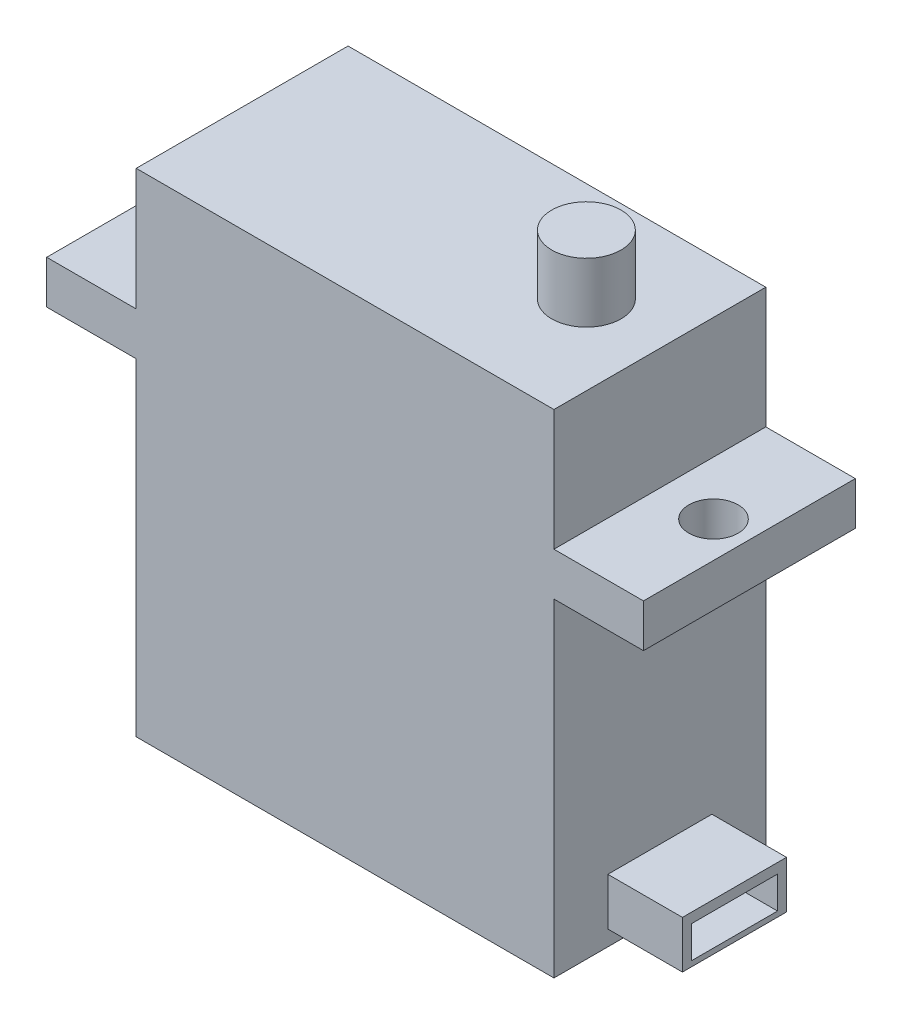
ISO-10303-21;
HEADER;
FILE_DESCRIPTION(('STEP AP214'),'2;1');
FILE_NAME('part.step','',(''),(''),'','','');
FILE_SCHEMA(('AUTOMOTIVE_DESIGN { 1 0 10303 214 1 1 1 1 }'));
ENDSEC;
DATA;
#1=APPLICATION_CONTEXT('core data for automotive mechanical design processes');
#2=APPLICATION_PROTOCOL_DEFINITION('international standard','automotive_design',2000,#1);
#3=PRODUCT_CONTEXT('',#1,'mechanical');
#4=PRODUCT('Part','Part','',(#3));
#5=PRODUCT_RELATED_PRODUCT_CATEGORY('part','',(#4));
#6=PRODUCT_DEFINITION_FORMATION('','',#4);
#7=PRODUCT_DEFINITION_CONTEXT('part definition',#1,'design');
#8=PRODUCT_DEFINITION('design','',#6,#7);
#9=PRODUCT_DEFINITION_SHAPE('','',#8);
#10=(LENGTH_UNIT() NAMED_UNIT(*) SI_UNIT(.MILLI.,.METRE.));
#11=(NAMED_UNIT(*) PLANE_ANGLE_UNIT() SI_UNIT($,.RADIAN.));
#12=(NAMED_UNIT(*) SI_UNIT($,.STERADIAN.) SOLID_ANGLE_UNIT());
#13=UNCERTAINTY_MEASURE_WITH_UNIT(LENGTH_MEASURE(1.E-05),#10,'distance_accuracy_value','');
#14=(GEOMETRIC_REPRESENTATION_CONTEXT(3) GLOBAL_UNCERTAINTY_ASSIGNED_CONTEXT((#13)) GLOBAL_UNIT_ASSIGNED_CONTEXT((#10,
#11,#12)) REPRESENTATION_CONTEXT('',''));
#15=CARTESIAN_POINT('',(0.,0.,0.));
#16=DIRECTION('',(0.,0.,1.));
#17=DIRECTION('',(1.,0.,0.));
#18=AXIS2_PLACEMENT_3D('',#15,#16,#17);
#19=CARTESIAN_POINT('',(0.,33.,0.));
#20=DIRECTION('',(-1.,0.,0.));
#21=DIRECTION('',(0.,0.,1.));
#22=AXIS2_PLACEMENT_3D('',#19,#20,#21);
#23=PLANE('',#22);
#24=DIRECTION('',(0.,-1.,0.));
#25=VECTOR('',#24,1.);
#26=CARTESIAN_POINT('',(0.,1.03633654772768,-3.61262373338085));
#27=LINE('',#26,#25);
#28=CARTESIAN_POINT('',(0.,4.21264494239171,-3.61262373338085));
#29=VERTEX_POINT('',#28);
#30=CARTESIAN_POINT('',(0.,1.03633654772768,-3.61262373338085));
#31=VERTEX_POINT('',#30);
#32=EDGE_CURVE('E270',#29,#31,#27,.T.);
#33=ORIENTED_EDGE('',*,*,#32,.F.);
#34=DIRECTION('',(0.,0.,1.));
#35=VECTOR('',#34,1.);
#36=CARTESIAN_POINT('',(0.,4.21264494239171,-10.5873762666191));
#37=LINE('',#36,#35);
#38=CARTESIAN_POINT('',(0.,4.21264494239171,-10.5873762666191));
#39=VERTEX_POINT('',#38);
#40=EDGE_CURVE('E281',#39,#29,#37,.T.);
#41=ORIENTED_EDGE('',*,*,#40,.F.);
#42=DIRECTION('',(0.,1.,0.));
#43=VECTOR('',#42,1.);
#44=CARTESIAN_POINT('',(0.,1.03633654772768,-10.5873762666191));
#45=LINE('',#44,#43);
#46=CARTESIAN_POINT('',(0.,1.03633654772768,-10.5873762666191));
#47=VERTEX_POINT('',#46);
#48=EDGE_CURVE('E293',#47,#39,#45,.T.);
#49=ORIENTED_EDGE('',*,*,#48,.F.);
#50=DIRECTION('',(0.,0.,-1.));
#51=VECTOR('',#50,1.);
#52=CARTESIAN_POINT('',(0.,1.03633654772768,-10.5873762666191));
#53=LINE('',#52,#51);
#54=EDGE_CURVE('E290',#31,#47,#53,.T.);
#55=ORIENTED_EDGE('',*,*,#54,.F.);
#56=EDGE_LOOP('',(#33,#41,#49,#55));
#57=FACE_BOUND('',#56,.T.);
#58=DIRECTION('',(0.,0.,-1.));
#59=VECTOR('',#58,1.);
#60=CARTESIAN_POINT('',(0.,22.,0.));
#61=LINE('',#60,#59);
#62=CARTESIAN_POINT('',(0.,22.,0.));
#63=VERTEX_POINT('',#62);
#64=CARTESIAN_POINT('',(0.,22.,-14.2));
#65=VERTEX_POINT('',#64);
#66=EDGE_CURVE('E204',#63,#65,#61,.T.);
#67=ORIENTED_EDGE('',*,*,#66,.F.);
#68=DIRECTION('',(0.,-1.,0.));
#69=VECTOR('',#68,1.);
#70=CARTESIAN_POINT('',(0.,33.,0.));
#71=LINE('',#70,#69);
#72=CARTESIAN_POINT('',(0.,0.,0.));
#73=VERTEX_POINT('',#72);
#74=EDGE_CURVE('E326',#63,#73,#71,.T.);
#75=ORIENTED_EDGE('',*,*,#74,.T.);
#76=DIRECTION('',(0.,0.,-1.));
#77=VECTOR('',#76,1.);
#78=CARTESIAN_POINT('',(0.,0.,0.));
#79=LINE('',#78,#77);
#80=CARTESIAN_POINT('',(0.,0.,-14.2));
#81=VERTEX_POINT('',#80);
#82=EDGE_CURVE('E313',#73,#81,#79,.T.);
#83=ORIENTED_EDGE('',*,*,#82,.T.);
#84=DIRECTION('',(0.,-1.,0.));
#85=VECTOR('',#84,1.);
#86=CARTESIAN_POINT('',(0.,33.,-14.2));
#87=LINE('',#86,#85);
#88=EDGE_CURVE('E50',#65,#81,#87,.T.);
#89=ORIENTED_EDGE('',*,*,#88,.F.);
#90=EDGE_LOOP('',(#67,#75,#83,#89));
#91=FACE_BOUND('',#90,.T.);
#92=ADVANCED_FACE('F41',(#57,#91),#23,.F.);
#93=CARTESIAN_POINT('',(-28.,33.,0.));
#94=DIRECTION('',(1.,0.,0.));
#95=DIRECTION('',(0.,0.,-1.));
#96=AXIS2_PLACEMENT_3D('',#93,#94,#95);
#97=PLANE('',#96);
#98=DIRECTION('',(0.,-1.,0.));
#99=VECTOR('',#98,1.);
#100=CARTESIAN_POINT('',(-28.,33.,-14.2));
#101=LINE('',#100,#99);
#102=CARTESIAN_POINT('',(-28.,33.,-14.2));
#103=VERTEX_POINT('',#102);
#104=CARTESIAN_POINT('',(-28.,24.8366827877608,-14.2));
#105=VERTEX_POINT('',#104);
#106=EDGE_CURVE('E342',#103,#105,#101,.T.);
#107=ORIENTED_EDGE('',*,*,#106,.T.);
#108=DIRECTION('',(0.,0.,1.));
#109=VECTOR('',#108,1.);
#110=CARTESIAN_POINT('',(-28.,24.8366827877608,0.));
#111=LINE('',#110,#109);
#112=CARTESIAN_POINT('',(-28.,24.8366827877608,0.));
#113=VERTEX_POINT('',#112);
#114=EDGE_CURVE('E216',#105,#113,#111,.T.);
#115=ORIENTED_EDGE('',*,*,#114,.T.);
#116=DIRECTION('',(0.,-1.,0.));
#117=VECTOR('',#116,1.);
#118=CARTESIAN_POINT('',(-28.,33.,0.));
#119=LINE('',#118,#117);
#120=CARTESIAN_POINT('',(-28.,33.,0.));
#121=VERTEX_POINT('',#120);
#122=EDGE_CURVE('E338',#121,#113,#119,.T.);
#123=ORIENTED_EDGE('',*,*,#122,.F.);
#124=DIRECTION('',(0.,0.,1.));
#125=VECTOR('',#124,1.);
#126=CARTESIAN_POINT('',(-28.,33.,0.));
#127=LINE('',#126,#125);
#128=EDGE_CURVE('E322',#103,#121,#127,.T.);
#129=ORIENTED_EDGE('',*,*,#128,.F.);
#130=EDGE_LOOP('',(#107,#115,#123,#129));
#131=FACE_BOUND('',#130,.T.);
#132=ADVANCED_FACE('F372',(#131),#97,.F.);
#133=CARTESIAN_POINT('',(0.,33.,0.));
#134=VERTEX_POINT('',#133);
#135=CARTESIAN_POINT('',(0.,24.89,0.));
#136=VERTEX_POINT('',#135);
#137=EDGE_CURVE('E335',#134,#136,#71,.T.);
#138=ORIENTED_EDGE('',*,*,#137,.T.);
#139=DIRECTION('',(0.,0.,-1.));
#140=VECTOR('',#139,1.);
#141=CARTESIAN_POINT('',(0.,24.89,0.));
#142=LINE('',#141,#140);
#143=CARTESIAN_POINT('',(0.,24.89,-14.2));
#144=VERTEX_POINT('',#143);
#145=EDGE_CURVE('E65',#136,#144,#142,.T.);
#146=ORIENTED_EDGE('',*,*,#145,.T.);
#147=CARTESIAN_POINT('',(0.,33.,-14.2));
#148=VERTEX_POINT('',#147);
#149=EDGE_CURVE('E11',#148,#144,#87,.T.);
#150=ORIENTED_EDGE('',*,*,#149,.F.);
#151=DIRECTION('',(0.,0.,-1.));
#152=VECTOR('',#151,1.);
#153=CARTESIAN_POINT('',(0.,33.,0.));
#154=LINE('',#153,#152);
#155=EDGE_CURVE('E316',#134,#148,#154,.T.);
#156=ORIENTED_EDGE('',*,*,#155,.F.);
#157=EDGE_LOOP('',(#138,#146,#150,#156));
#158=FACE_BOUND('',#157,.T.);
#159=ADVANCED_FACE('F43',(#158),#23,.F.);
#160=CARTESIAN_POINT('',(0.,33.,-14.2));
#161=DIRECTION('',(0.,0.,1.));
#162=DIRECTION('',(1.,0.,0.));
#163=AXIS2_PLACEMENT_3D('',#160,#161,#162);
#164=PLANE('',#163);
#165=DIRECTION('',(-1.,0.,0.));
#166=VECTOR('',#165,1.);
#167=CARTESIAN_POINT('',(0.,0.,-14.2));
#168=LINE('',#167,#166);
#169=CARTESIAN_POINT('',(-28.,0.,-14.2));
#170=VERTEX_POINT('',#169);
#171=EDGE_CURVE('E328',#81,#170,#168,.T.);
#172=ORIENTED_EDGE('',*,*,#171,.T.);
#173=CARTESIAN_POINT('',(-28.,21.9439231611703,-14.2));
#174=VERTEX_POINT('',#173);
#175=EDGE_CURVE('E341',#174,#170,#101,.T.);
#176=ORIENTED_EDGE('',*,*,#175,.F.);
#177=DIRECTION('',(1.,0.,0.));
#178=VECTOR('',#177,1.);
#179=CARTESIAN_POINT('',(-34.,21.9439231611703,-14.2));
#180=LINE('',#179,#178);
#181=CARTESIAN_POINT('',(-34.,21.9439231611703,-14.2));
#182=VERTEX_POINT('',#181);
#183=EDGE_CURVE('E240',#182,#174,#180,.T.);
#184=ORIENTED_EDGE('',*,*,#183,.F.);
#185=DIRECTION('',(0.,-1.,0.));
#186=VECTOR('',#185,1.);
#187=CARTESIAN_POINT('',(-34.,0.,-14.2));
#188=LINE('',#187,#186);
#189=CARTESIAN_POINT('',(-34.,24.8366827877608,-14.2));
#190=VERTEX_POINT('',#189);
#191=EDGE_CURVE('E224',#190,#182,#188,.T.);
#192=ORIENTED_EDGE('',*,*,#191,.F.);
#193=DIRECTION('',(1.,0.,0.));
#194=VECTOR('',#193,1.);
#195=CARTESIAN_POINT('',(-34.,24.8366827877608,-14.2));
#196=LINE('',#195,#194);
#197=EDGE_CURVE('E242',#190,#105,#196,.T.);
#198=ORIENTED_EDGE('',*,*,#197,.T.);
#199=ORIENTED_EDGE('',*,*,#106,.F.);
#200=DIRECTION('',(-1.,0.,0.));
#201=VECTOR('',#200,1.);
#202=CARTESIAN_POINT('',(0.,33.,-14.2));
#203=LINE('',#202,#201);
#204=EDGE_CURVE('E319',#148,#103,#203,.T.);
#205=ORIENTED_EDGE('',*,*,#204,.F.);
#206=ORIENTED_EDGE('',*,*,#149,.T.);
#207=DIRECTION('',(-1.,0.,0.));
#208=VECTOR('',#207,1.);
#209=CARTESIAN_POINT('',(6.,24.89,-14.2));
#210=LINE('',#209,#208);
#211=CARTESIAN_POINT('',(6.,24.89,-14.2));
#212=VERTEX_POINT('',#211);
#213=EDGE_CURVE('E194',#212,#144,#210,.T.);
#214=ORIENTED_EDGE('',*,*,#213,.F.);
#215=DIRECTION('',(0.,1.,0.));
#216=VECTOR('',#215,1.);
#217=CARTESIAN_POINT('',(6.,22.,-14.2));
#218=LINE('',#217,#216);
#219=CARTESIAN_POINT('',(6.,22.,-14.2));
#220=VERTEX_POINT('',#219);
#221=EDGE_CURVE('E180',#220,#212,#218,.T.);
#222=ORIENTED_EDGE('',*,*,#221,.F.);
#223=DIRECTION('',(-1.,0.,0.));
#224=VECTOR('',#223,1.);
#225=CARTESIAN_POINT('',(6.,22.,-14.2));
#226=LINE('',#225,#224);
#227=EDGE_CURVE('E198',#220,#65,#226,.T.);
#228=ORIENTED_EDGE('',*,*,#227,.T.);
#229=ORIENTED_EDGE('',*,*,#88,.T.);
#230=EDGE_LOOP('',(#172,#176,#184,#192,#198,#199,#205,#206,#214,#222,#228,#229));
#231=FACE_BOUND('',#230,.T.);
#232=ADVANCED_FACE('F196',(#231),#164,.F.);
#233=CARTESIAN_POINT('',(-28.,21.9439231611703,0.));
#234=VERTEX_POINT('',#233);
#235=CARTESIAN_POINT('',(-28.,0.,0.));
#236=VERTEX_POINT('',#235);
#237=EDGE_CURVE('E337',#234,#236,#119,.T.);
#238=ORIENTED_EDGE('',*,*,#237,.F.);
#239=DIRECTION('',(0.,0.,-1.));
#240=VECTOR('',#239,1.);
#241=CARTESIAN_POINT('',(-28.,21.9439231611703,0.));
#242=LINE('',#241,#240);
#243=EDGE_CURVE('E225',#234,#174,#242,.T.);
#244=ORIENTED_EDGE('',*,*,#243,.T.);
#245=ORIENTED_EDGE('',*,*,#175,.T.);
#246=DIRECTION('',(0.,0.,1.));
#247=VECTOR('',#246,1.);
#248=CARTESIAN_POINT('',(-28.,0.,0.));
#249=LINE('',#248,#247);
#250=EDGE_CURVE('E330',#170,#236,#249,.T.);
#251=ORIENTED_EDGE('',*,*,#250,.T.);
#252=EDGE_LOOP('',(#238,#244,#245,#251));
#253=FACE_BOUND('',#252,.T.);
#254=ADVANCED_FACE('F392',(#253),#97,.F.);
#255=CARTESIAN_POINT('',(0.,33.,0.));
#256=DIRECTION('',(0.,0.,-1.));
#257=DIRECTION('',(-1.,0.,0.));
#258=AXIS2_PLACEMENT_3D('',#255,#256,#257);
#259=PLANE('',#258);
#260=DIRECTION('',(1.,0.,0.));
#261=VECTOR('',#260,1.);
#262=CARTESIAN_POINT('',(0.,0.,0.));
#263=LINE('',#262,#261);
#264=EDGE_CURVE('E320',#236,#73,#263,.T.);
#265=ORIENTED_EDGE('',*,*,#264,.T.);
#266=ORIENTED_EDGE('',*,*,#74,.F.);
#267=DIRECTION('',(-1.,0.,0.));
#268=VECTOR('',#267,1.);
#269=CARTESIAN_POINT('',(6.,22.,0.));
#270=LINE('',#269,#268);
#271=CARTESIAN_POINT('',(6.,22.,0.));
#272=VERTEX_POINT('',#271);
#273=EDGE_CURVE('E217',#272,#63,#270,.T.);
#274=ORIENTED_EDGE('',*,*,#273,.F.);
#275=DIRECTION('',(0.,1.,0.));
#276=VECTOR('',#275,1.);
#277=CARTESIAN_POINT('',(6.,22.,0.));
#278=LINE('',#277,#276);
#279=CARTESIAN_POINT('',(6.,24.89,0.));
#280=VERTEX_POINT('',#279);
#281=EDGE_CURVE('E199',#272,#280,#278,.T.);
#282=ORIENTED_EDGE('',*,*,#281,.T.);
#283=DIRECTION('',(-1.,0.,0.));
#284=VECTOR('',#283,1.);
#285=CARTESIAN_POINT('',(6.,24.89,0.));
#286=LINE('',#285,#284);
#287=EDGE_CURVE('E203',#280,#136,#286,.T.);
#288=ORIENTED_EDGE('',*,*,#287,.T.);
#289=ORIENTED_EDGE('',*,*,#137,.F.);
#290=DIRECTION('',(1.,0.,0.));
#291=VECTOR('',#290,1.);
#292=CARTESIAN_POINT('',(0.,33.,0.));
#293=LINE('',#292,#291);
#294=EDGE_CURVE('E324',#121,#134,#293,.T.);
#295=ORIENTED_EDGE('',*,*,#294,.F.);
#296=ORIENTED_EDGE('',*,*,#122,.T.);
#297=DIRECTION('',(1.,0.,0.));
#298=VECTOR('',#297,1.);
#299=CARTESIAN_POINT('',(-34.,24.8366827877608,0.));
#300=LINE('',#299,#298);
#301=CARTESIAN_POINT('',(-34.,24.8366827877608,0.));
#302=VERTEX_POINT('',#301);
#303=EDGE_CURVE('E232',#302,#113,#300,.T.);
#304=ORIENTED_EDGE('',*,*,#303,.F.);
#305=DIRECTION('',(0.,1.,0.));
#306=VECTOR('',#305,1.);
#307=CARTESIAN_POINT('',(-34.,0.,0.));
#308=LINE('',#307,#306);
#309=CARTESIAN_POINT('',(-34.,21.9439231611703,0.));
#310=VERTEX_POINT('',#309);
#311=EDGE_CURVE('E230',#310,#302,#308,.T.);
#312=ORIENTED_EDGE('',*,*,#311,.F.);
#313=DIRECTION('',(1.,0.,0.));
#314=VECTOR('',#313,1.);
#315=CARTESIAN_POINT('',(-34.,21.9439231611703,0.));
#316=LINE('',#315,#314);
#317=EDGE_CURVE('E238',#310,#234,#316,.T.);
#318=ORIENTED_EDGE('',*,*,#317,.T.);
#319=ORIENTED_EDGE('',*,*,#237,.T.);
#320=EDGE_LOOP('',(#265,#266,#274,#282,#288,#289,#295,#296,#304,#312,#318,#319));
#321=FACE_BOUND('',#320,.T.);
#322=ADVANCED_FACE('F381',(#321),#259,.F.);
#323=CARTESIAN_POINT('',(0.,33.,0.));
#324=DIRECTION('',(0.,1.,0.));
#325=DIRECTION('',(0.,0.,1.));
#326=AXIS2_PLACEMENT_3D('',#323,#324,#325);
#327=PLANE('',#326);
#328=CARTESIAN_POINT('',(-5.33154291204438,33.,-7.50633392599804));
#329=DIRECTION('',(0.,1.,0.));
#330=DIRECTION('',(0.,0.,1.));
#331=AXIS2_PLACEMENT_3D('',#328,#329,#330);
#332=CIRCLE('',#331,2.32190814855954);
#333=CARTESIAN_POINT('',(-5.33154291204438,33.,-5.1844257774385));
#334=VERTEX_POINT('',#333);
#335=EDGE_CURVE('E309',#334,#334,#332,.T.);
#336=ORIENTED_EDGE('',*,*,#335,.F.);
#337=EDGE_LOOP('',(#336));
#338=FACE_BOUND('',#337,.T.);
#339=ORIENTED_EDGE('',*,*,#155,.T.);
#340=ORIENTED_EDGE('',*,*,#204,.T.);
#341=ORIENTED_EDGE('',*,*,#128,.T.);
#342=ORIENTED_EDGE('',*,*,#294,.T.);
#343=EDGE_LOOP('',(#339,#340,#341,#342));
#344=FACE_BOUND('',#343,.T.);
#345=ADVANCED_FACE('F386',(#338,#344),#327,.T.);
#346=CARTESIAN_POINT('',(0.,0.,0.));
#347=DIRECTION('',(0.,1.,0.));
#348=DIRECTION('',(0.,0.,1.));
#349=AXIS2_PLACEMENT_3D('',#346,#347,#348);
#350=PLANE('',#349);
#351=ORIENTED_EDGE('',*,*,#82,.F.);
#352=ORIENTED_EDGE('',*,*,#264,.F.);
#353=ORIENTED_EDGE('',*,*,#250,.F.);
#354=ORIENTED_EDGE('',*,*,#171,.F.);
#355=EDGE_LOOP('',(#351,#352,#353,#354));
#356=FACE_BOUND('',#355,.T.);
#357=ADVANCED_FACE('F406',(#356),#350,.F.);
#358=CARTESIAN_POINT('',(-5.33154291204438,37.,-7.50633392599804));
#359=DIRECTION('',(0.,-1.,0.));
#360=DIRECTION('',(0.,0.,-1.));
#361=AXIS2_PLACEMENT_3D('',#358,#359,#360);
#362=CYLINDRICAL_SURFACE('',#361,2.32190814855954);
#363=CARTESIAN_POINT('',(-5.33154291204438,37.,-7.50633392599804));
#364=DIRECTION('',(0.,1.,0.));
#365=DIRECTION('',(0.,0.,1.));
#366=AXIS2_PLACEMENT_3D('',#363,#364,#365);
#367=CIRCLE('',#366,2.32190814855954);
#368=CARTESIAN_POINT('',(-5.33154291204438,37.,-5.1844257774385));
#369=VERTEX_POINT('',#368);
#370=EDGE_CURVE('E310',#369,#369,#367,.T.);
#371=ORIENTED_EDGE('',*,*,#370,.F.);
#372=EDGE_LOOP('',(#371));
#373=FACE_BOUND('',#372,.T.);
#374=ORIENTED_EDGE('',*,*,#335,.T.);
#375=EDGE_LOOP('',(#374));
#376=FACE_BOUND('',#375,.T.);
#377=ADVANCED_FACE('F461',(#373,#376),#362,.T.);
#378=CARTESIAN_POINT('',(-5.33154291204438,37.,-7.50633392599804));
#379=DIRECTION('',(0.,1.,0.));
#380=DIRECTION('',(0.,0.,1.));
#381=AXIS2_PLACEMENT_3D('',#378,#379,#380);
#382=PLANE('',#381);
#383=ORIENTED_EDGE('',*,*,#370,.T.);
#384=EDGE_LOOP('',(#383));
#385=FACE_BOUND('',#384,.T.);
#386=ADVANCED_FACE('F457',(#385),#382,.T.);
#387=CARTESIAN_POINT('',(5.,1.03633654772768,-3.61262373338085));
#388=DIRECTION('',(0.,0.,-1.));
#389=DIRECTION('',(-1.,0.,0.));
#390=AXIS2_PLACEMENT_3D('',#387,#388,#389);
#391=PLANE('',#390);
#392=ORIENTED_EDGE('',*,*,#32,.T.);
#393=DIRECTION('',(-1.,0.,0.));
#394=VECTOR('',#393,1.);
#395=CARTESIAN_POINT('',(5.,1.03633654772768,-3.61262373338085));
#396=LINE('',#395,#394);
#397=CARTESIAN_POINT('',(5.,1.03633654772768,-3.61262373338085));
#398=VERTEX_POINT('',#397);
#399=EDGE_CURVE('E306',#398,#31,#396,.T.);
#400=ORIENTED_EDGE('',*,*,#399,.F.);
#401=DIRECTION('',(0.,-1.,0.));
#402=VECTOR('',#401,1.);
#403=CARTESIAN_POINT('',(5.,1.03633654772768,-3.61262373338085));
#404=LINE('',#403,#402);
#405=CARTESIAN_POINT('',(5.,4.21264494239171,-3.61262373338085));
#406=VERTEX_POINT('',#405);
#407=EDGE_CURVE('E277',#406,#398,#404,.T.);
#408=ORIENTED_EDGE('',*,*,#407,.F.);
#409=DIRECTION('',(-1.,0.,0.));
#410=VECTOR('',#409,1.);
#411=CARTESIAN_POINT('',(5.,4.21264494239171,-3.61262373338085));
#412=LINE('',#411,#410);
#413=EDGE_CURVE('E287',#406,#29,#412,.T.);
#414=ORIENTED_EDGE('',*,*,#413,.T.);
#415=EDGE_LOOP('',(#392,#400,#408,#414));
#416=FACE_BOUND('',#415,.T.);
#417=ADVANCED_FACE('F453',(#416),#391,.F.);
#418=CARTESIAN_POINT('',(5.,1.03633654772768,-10.5873762666191));
#419=DIRECTION('',(0.,1.,0.));
#420=DIRECTION('',(0.,0.,1.));
#421=AXIS2_PLACEMENT_3D('',#418,#419,#420);
#422=PLANE('',#421);
#423=ORIENTED_EDGE('',*,*,#54,.T.);
#424=DIRECTION('',(-1.,0.,0.));
#425=VECTOR('',#424,1.);
#426=CARTESIAN_POINT('',(5.,1.03633654772768,-10.5873762666191));
#427=LINE('',#426,#425);
#428=CARTESIAN_POINT('',(5.,1.03633654772768,-10.5873762666191));
#429=VERTEX_POINT('',#428);
#430=EDGE_CURVE('E303',#429,#47,#427,.T.);
#431=ORIENTED_EDGE('',*,*,#430,.F.);
#432=DIRECTION('',(0.,0.,-1.));
#433=VECTOR('',#432,1.);
#434=CARTESIAN_POINT('',(5.,1.03633654772768,-10.5873762666191));
#435=LINE('',#434,#433);
#436=EDGE_CURVE('E280',#398,#429,#435,.T.);
#437=ORIENTED_EDGE('',*,*,#436,.F.);
#438=ORIENTED_EDGE('',*,*,#399,.T.);
#439=EDGE_LOOP('',(#423,#431,#437,#438));
#440=FACE_BOUND('',#439,.T.);
#441=ADVANCED_FACE('F449',(#440),#422,.F.);
#442=CARTESIAN_POINT('',(5.,1.03633654772768,-10.5873762666191));
#443=DIRECTION('',(0.,0.,1.));
#444=DIRECTION('',(1.,0.,0.));
#445=AXIS2_PLACEMENT_3D('',#442,#443,#444);
#446=PLANE('',#445);
#447=ORIENTED_EDGE('',*,*,#48,.T.);
#448=DIRECTION('',(-1.,0.,0.));
#449=VECTOR('',#448,1.);
#450=CARTESIAN_POINT('',(5.,4.21264494239171,-10.5873762666191));
#451=LINE('',#450,#449);
#452=CARTESIAN_POINT('',(5.,4.21264494239171,-10.5873762666191));
#453=VERTEX_POINT('',#452);
#454=EDGE_CURVE('E300',#453,#39,#451,.T.);
#455=ORIENTED_EDGE('',*,*,#454,.F.);
#456=DIRECTION('',(0.,1.,0.));
#457=VECTOR('',#456,1.);
#458=CARTESIAN_POINT('',(5.,1.03633654772768,-10.5873762666191));
#459=LINE('',#458,#457);
#460=EDGE_CURVE('E283',#429,#453,#459,.T.);
#461=ORIENTED_EDGE('',*,*,#460,.F.);
#462=ORIENTED_EDGE('',*,*,#430,.T.);
#463=EDGE_LOOP('',(#447,#455,#461,#462));
#464=FACE_BOUND('',#463,.T.);
#465=ADVANCED_FACE('F445',(#464),#446,.F.);
#466=CARTESIAN_POINT('',(5.,4.21264494239171,-10.5873762666191));
#467=DIRECTION('',(0.,-1.,0.));
#468=DIRECTION('',(0.,0.,-1.));
#469=AXIS2_PLACEMENT_3D('',#466,#467,#468);
#470=PLANE('',#469);
#471=ORIENTED_EDGE('',*,*,#40,.T.);
#472=ORIENTED_EDGE('',*,*,#413,.F.);
#473=DIRECTION('',(0.,0.,1.));
#474=VECTOR('',#473,1.);
#475=CARTESIAN_POINT('',(5.,4.21264494239171,-10.5873762666191));
#476=LINE('',#475,#474);
#477=EDGE_CURVE('E285',#453,#406,#476,.T.);
#478=ORIENTED_EDGE('',*,*,#477,.F.);
#479=ORIENTED_EDGE('',*,*,#454,.T.);
#480=EDGE_LOOP('',(#471,#472,#478,#479));
#481=FACE_BOUND('',#480,.T.);
#482=ADVANCED_FACE('F441',(#481),#470,.F.);
#483=CARTESIAN_POINT('',(5.,0.,0.));
#484=DIRECTION('',(1.,0.,0.));
#485=DIRECTION('',(0.,0.,-1.));
#486=AXIS2_PLACEMENT_3D('',#483,#484,#485);
#487=PLANE('',#486);
#488=DIRECTION('',(0.,1.,0.));
#489=VECTOR('',#488,1.);
#490=CARTESIAN_POINT('',(5.,1.39297741903932,-9.98876287969833));
#491=LINE('',#490,#489);
#492=CARTESIAN_POINT('',(5.,1.39297741903932,-9.98876287969833));
#493=VERTEX_POINT('',#492);
#494=CARTESIAN_POINT('',(5.,3.54275444579156,-9.98876287969833));
#495=VERTEX_POINT('',#494);
#496=EDGE_CURVE('E244',#493,#495,#491,.T.);
#497=ORIENTED_EDGE('',*,*,#496,.F.);
#498=DIRECTION('',(0.,0.,-1.));
#499=VECTOR('',#498,1.);
#500=CARTESIAN_POINT('',(5.,1.39297741903932,-4.21123712030167));
#501=LINE('',#500,#499);
#502=CARTESIAN_POINT('',(5.,1.39297741903932,-4.21123712030167));
#503=VERTEX_POINT('',#502);
#504=EDGE_CURVE('E249',#503,#493,#501,.T.);
#505=ORIENTED_EDGE('',*,*,#504,.F.);
#506=DIRECTION('',(0.,-1.,0.));
#507=VECTOR('',#506,1.);
#508=CARTESIAN_POINT('',(5.,1.39297741903932,-4.21123712030167));
#509=LINE('',#508,#507);
#510=CARTESIAN_POINT('',(5.,3.54275444579156,-4.21123712030167));
#511=VERTEX_POINT('',#510);
#512=EDGE_CURVE('E263',#511,#503,#509,.T.);
#513=ORIENTED_EDGE('',*,*,#512,.F.);
#514=DIRECTION('',(0.,0.,1.));
#515=VECTOR('',#514,1.);
#516=CARTESIAN_POINT('',(5.,3.54275444579156,-4.21123712030167));
#517=LINE('',#516,#515);
#518=EDGE_CURVE('E260',#495,#511,#517,.T.);
#519=ORIENTED_EDGE('',*,*,#518,.F.);
#520=EDGE_LOOP('',(#497,#505,#513,#519));
#521=FACE_BOUND('',#520,.T.);
#522=ORIENTED_EDGE('',*,*,#407,.T.);
#523=ORIENTED_EDGE('',*,*,#436,.T.);
#524=ORIENTED_EDGE('',*,*,#460,.T.);
#525=ORIENTED_EDGE('',*,*,#477,.T.);
#526=EDGE_LOOP('',(#522,#523,#524,#525));
#527=FACE_BOUND('',#526,.T.);
#528=ADVANCED_FACE('F437',(#521,#527),#487,.T.);
#529=CARTESIAN_POINT('',(0.,1.39297741903932,-9.98876287969833));
#530=DIRECTION('',(0.,0.,-1.));
#531=DIRECTION('',(-1.,0.,0.));
#532=AXIS2_PLACEMENT_3D('',#529,#530,#531);
#533=PLANE('',#532);
#534=ORIENTED_EDGE('',*,*,#496,.T.);
#535=DIRECTION('',(1.,0.,0.));
#536=VECTOR('',#535,1.);
#537=CARTESIAN_POINT('',(0.,3.54275444579156,-9.98876287969833));
#538=LINE('',#537,#536);
#539=CARTESIAN_POINT('',(0.,3.54275444579156,-9.98876287969833));
#540=VERTEX_POINT('',#539);
#541=EDGE_CURVE('E258',#540,#495,#538,.T.);
#542=ORIENTED_EDGE('',*,*,#541,.F.);
#543=DIRECTION('',(0.,1.,0.));
#544=VECTOR('',#543,1.);
#545=CARTESIAN_POINT('',(0.,1.39297741903932,-9.98876287969833));
#546=LINE('',#545,#544);
#547=CARTESIAN_POINT('',(0.,1.39297741903932,-9.98876287969833));
#548=VERTEX_POINT('',#547);
#549=EDGE_CURVE('E245',#548,#540,#546,.T.);
#550=ORIENTED_EDGE('',*,*,#549,.F.);
#551=DIRECTION('',(1.,0.,0.));
#552=VECTOR('',#551,1.);
#553=CARTESIAN_POINT('',(0.,1.39297741903932,-9.98876287969833));
#554=LINE('',#553,#552);
#555=EDGE_CURVE('E268',#548,#493,#554,.T.);
#556=ORIENTED_EDGE('',*,*,#555,.T.);
#557=EDGE_LOOP('',(#534,#542,#550,#556));
#558=FACE_BOUND('',#557,.T.);
#559=ADVANCED_FACE('F427',(#558),#533,.F.);
#560=CARTESIAN_POINT('',(0.,1.39297741903932,-4.21123712030167));
#561=DIRECTION('',(0.,-1.,0.));
#562=DIRECTION('',(0.,0.,-1.));
#563=AXIS2_PLACEMENT_3D('',#560,#561,#562);
#564=PLANE('',#563);
#565=ORIENTED_EDGE('',*,*,#504,.T.);
#566=ORIENTED_EDGE('',*,*,#555,.F.);
#567=DIRECTION('',(0.,0.,-1.));
#568=VECTOR('',#567,1.);
#569=CARTESIAN_POINT('',(0.,1.39297741903932,-4.21123712030167));
#570=LINE('',#569,#568);
#571=CARTESIAN_POINT('',(0.,1.39297741903932,-4.21123712030167));
#572=VERTEX_POINT('',#571);
#573=EDGE_CURVE('E255',#572,#548,#570,.T.);
#574=ORIENTED_EDGE('',*,*,#573,.F.);
#575=DIRECTION('',(1.,0.,0.));
#576=VECTOR('',#575,1.);
#577=CARTESIAN_POINT('',(0.,1.39297741903932,-4.21123712030167));
#578=LINE('',#577,#576);
#579=EDGE_CURVE('E271',#572,#503,#578,.T.);
#580=ORIENTED_EDGE('',*,*,#579,.T.);
#581=EDGE_LOOP('',(#565,#566,#574,#580));
#582=FACE_BOUND('',#581,.T.);
#583=ADVANCED_FACE('F423',(#582),#564,.F.);
#584=CARTESIAN_POINT('',(0.,1.39297741903932,-4.21123712030167));
#585=DIRECTION('',(0.,0.,1.));
#586=DIRECTION('',(1.,0.,0.));
#587=AXIS2_PLACEMENT_3D('',#584,#585,#586);
#588=PLANE('',#587);
#589=ORIENTED_EDGE('',*,*,#512,.T.);
#590=ORIENTED_EDGE('',*,*,#579,.F.);
#591=DIRECTION('',(0.,-1.,0.));
#592=VECTOR('',#591,1.);
#593=CARTESIAN_POINT('',(0.,1.39297741903932,-4.21123712030167));
#594=LINE('',#593,#592);
#595=CARTESIAN_POINT('',(0.,3.54275444579156,-4.21123712030167));
#596=VERTEX_POINT('',#595);
#597=EDGE_CURVE('E252',#596,#572,#594,.T.);
#598=ORIENTED_EDGE('',*,*,#597,.F.);
#599=DIRECTION('',(1.,0.,0.));
#600=VECTOR('',#599,1.);
#601=CARTESIAN_POINT('',(0.,3.54275444579156,-4.21123712030167));
#602=LINE('',#601,#600);
#603=EDGE_CURVE('E273',#596,#511,#602,.T.);
#604=ORIENTED_EDGE('',*,*,#603,.T.);
#605=EDGE_LOOP('',(#589,#590,#598,#604));
#606=FACE_BOUND('',#605,.T.);
#607=ADVANCED_FACE('F426',(#606),#588,.F.);
#608=CARTESIAN_POINT('',(0.,3.54275444579156,-4.21123712030167));
#609=DIRECTION('',(0.,1.,0.));
#610=DIRECTION('',(0.,0.,1.));
#611=AXIS2_PLACEMENT_3D('',#608,#609,#610);
#612=PLANE('',#611);
#613=ORIENTED_EDGE('',*,*,#518,.T.);
#614=ORIENTED_EDGE('',*,*,#603,.F.);
#615=DIRECTION('',(0.,0.,1.));
#616=VECTOR('',#615,1.);
#617=CARTESIAN_POINT('',(0.,3.54275444579156,-4.21123712030167));
#618=LINE('',#617,#616);
#619=EDGE_CURVE('E248',#540,#596,#618,.T.);
#620=ORIENTED_EDGE('',*,*,#619,.F.);
#621=ORIENTED_EDGE('',*,*,#541,.T.);
#622=EDGE_LOOP('',(#613,#614,#620,#621));
#623=FACE_BOUND('',#622,.T.);
#624=ADVANCED_FACE('F421',(#623),#612,.F.);
#625=CARTESIAN_POINT('',(0.,0.,0.));
#626=DIRECTION('',(-1.,0.,0.));
#627=DIRECTION('',(0.,0.,1.));
#628=AXIS2_PLACEMENT_3D('',#625,#626,#627);
#629=PLANE('',#628);
#630=ORIENTED_EDGE('',*,*,#549,.T.);
#631=ORIENTED_EDGE('',*,*,#619,.T.);
#632=ORIENTED_EDGE('',*,*,#597,.T.);
#633=ORIENTED_EDGE('',*,*,#573,.T.);
#634=EDGE_LOOP('',(#630,#631,#632,#633));
#635=FACE_BOUND('',#634,.T.);
#636=ADVANCED_FACE('F363',(#635),#629,.F.);
#637=CARTESIAN_POINT('',(-34.,24.8366827877608,0.));
#638=DIRECTION('',(0.,1.,0.));
#639=DIRECTION('',(0.,0.,1.));
#640=AXIS2_PLACEMENT_3D('',#637,#638,#639);
#641=PLANE('',#640);
#642=CARTESIAN_POINT('',(-31.3352088529888,24.8366827877608,-7.1));
#643=DIRECTION('',(0.,1.,0.));
#644=DIRECTION('',(0.,0.,1.));
#645=AXIS2_PLACEMENT_3D('',#642,#643,#644);
#646=CIRCLE('',#645,1.651);
#647=CARTESIAN_POINT('',(-31.3352088529888,24.8366827877608,-5.449));
#648=VERTEX_POINT('',#647);
#649=EDGE_CURVE('E351',#648,#648,#646,.T.);
#650=ORIENTED_EDGE('',*,*,#649,.F.);
#651=EDGE_LOOP('',(#650));
#652=FACE_BOUND('',#651,.T.);
#653=ORIENTED_EDGE('',*,*,#114,.F.);
#654=ORIENTED_EDGE('',*,*,#197,.F.);
#655=DIRECTION('',(0.,0.,1.));
#656=VECTOR('',#655,1.);
#657=CARTESIAN_POINT('',(-34.,24.8366827877608,0.));
#658=LINE('',#657,#656);
#659=EDGE_CURVE('E221',#190,#302,#658,.T.);
#660=ORIENTED_EDGE('',*,*,#659,.T.);
#661=ORIENTED_EDGE('',*,*,#303,.T.);
#662=EDGE_LOOP('',(#653,#654,#660,#661));
#663=FACE_BOUND('',#662,.T.);
#664=ADVANCED_FACE('F359',(#652,#663),#641,.T.);
#665=CARTESIAN_POINT('',(-34.,21.9439231611703,0.));
#666=DIRECTION('',(0.,-1.,0.));
#667=DIRECTION('',(0.,0.,-1.));
#668=AXIS2_PLACEMENT_3D('',#665,#666,#667);
#669=PLANE('',#668);
#670=CARTESIAN_POINT('',(-31.3352088529888,21.9439231611703,-7.1));
#671=DIRECTION('',(0.,-1.,0.));
#672=DIRECTION('',(0.,0.,-1.));
#673=AXIS2_PLACEMENT_3D('',#670,#671,#672);
#674=CIRCLE('',#673,1.651);
#675=CARTESIAN_POINT('',(-31.3352088529888,21.9439231611703,-8.751));
#676=VERTEX_POINT('',#675);
#677=EDGE_CURVE('E45',#676,#676,#674,.T.);
#678=ORIENTED_EDGE('',*,*,#677,.F.);
#679=EDGE_LOOP('',(#678));
#680=FACE_BOUND('',#679,.T.);
#681=ORIENTED_EDGE('',*,*,#243,.F.);
#682=ORIENTED_EDGE('',*,*,#317,.F.);
#683=DIRECTION('',(0.,0.,-1.));
#684=VECTOR('',#683,1.);
#685=CARTESIAN_POINT('',(-34.,21.9439231611703,0.));
#686=LINE('',#685,#684);
#687=EDGE_CURVE('E227',#310,#182,#686,.T.);
#688=ORIENTED_EDGE('',*,*,#687,.T.);
#689=ORIENTED_EDGE('',*,*,#183,.T.);
#690=EDGE_LOOP('',(#681,#682,#688,#689));
#691=FACE_BOUND('',#690,.T.);
#692=ADVANCED_FACE('F362',(#680,#691),#669,.T.);
#693=CARTESIAN_POINT('',(-34.,0.,0.));
#694=DIRECTION('',(-1.,0.,0.));
#695=DIRECTION('',(0.,0.,1.));
#696=AXIS2_PLACEMENT_3D('',#693,#694,#695);
#697=PLANE('',#696);
#698=ORIENTED_EDGE('',*,*,#659,.F.);
#699=ORIENTED_EDGE('',*,*,#191,.T.);
#700=ORIENTED_EDGE('',*,*,#687,.F.);
#701=ORIENTED_EDGE('',*,*,#311,.T.);
#702=EDGE_LOOP('',(#698,#699,#700,#701));
#703=FACE_BOUND('',#702,.T.);
#704=ADVANCED_FACE('F378',(#703),#697,.T.);
#705=CARTESIAN_POINT('',(6.,24.89,0.));
#706=DIRECTION('',(0.,1.,0.));
#707=DIRECTION('',(0.,0.,1.));
#708=AXIS2_PLACEMENT_3D('',#705,#706,#707);
#709=PLANE('',#708);
#710=CARTESIAN_POINT('',(3.59449448157172,24.89,-7.1));
#711=DIRECTION('',(0.,1.,0.));
#712=DIRECTION('',(0.,0.,1.));
#713=AXIS2_PLACEMENT_3D('',#710,#711,#712);
#714=CIRCLE('',#713,1.651);
#715=CARTESIAN_POINT('',(3.59449448157172,24.89,-5.449));
#716=VERTEX_POINT('',#715);
#717=EDGE_CURVE('E208',#716,#716,#714,.T.);
#718=ORIENTED_EDGE('',*,*,#717,.F.);
#719=EDGE_LOOP('',(#718));
#720=FACE_BOUND('',#719,.T.);
#721=ORIENTED_EDGE('',*,*,#145,.F.);
#722=ORIENTED_EDGE('',*,*,#287,.F.);
#723=DIRECTION('',(0.,0.,-1.));
#724=VECTOR('',#723,1.);
#725=CARTESIAN_POINT('',(6.,24.89,0.));
#726=LINE('',#725,#724);
#727=EDGE_CURVE('E185',#280,#212,#726,.T.);
#728=ORIENTED_EDGE('',*,*,#727,.T.);
#729=ORIENTED_EDGE('',*,*,#213,.T.);
#730=EDGE_LOOP('',(#721,#722,#728,#729));
#731=FACE_BOUND('',#730,.T.);
#732=ADVANCED_FACE('F201',(#720,#731),#709,.T.);
#733=CARTESIAN_POINT('',(6.,22.,0.));
#734=DIRECTION('',(0.,1.,0.));
#735=DIRECTION('',(0.,0.,1.));
#736=AXIS2_PLACEMENT_3D('',#733,#734,#735);
#737=PLANE('',#736);
#738=CARTESIAN_POINT('',(3.59449448157172,22.,-7.1));
#739=DIRECTION('',(0.,1.,0.));
#740=DIRECTION('',(0.,0.,1.));
#741=AXIS2_PLACEMENT_3D('',#738,#739,#740);
#742=CIRCLE('',#741,1.651);
#743=CARTESIAN_POINT('',(3.59449448157172,22.,-5.449));
#744=VERTEX_POINT('',#743);
#745=EDGE_CURVE('E213',#744,#744,#742,.T.);
#746=ORIENTED_EDGE('',*,*,#745,.T.);
#747=EDGE_LOOP('',(#746));
#748=FACE_BOUND('',#747,.T.);
#749=ORIENTED_EDGE('',*,*,#66,.T.);
#750=ORIENTED_EDGE('',*,*,#227,.F.);
#751=DIRECTION('',(0.,0.,-1.));
#752=VECTOR('',#751,1.);
#753=CARTESIAN_POINT('',(6.,22.,0.));
#754=LINE('',#753,#752);
#755=EDGE_CURVE('E188',#272,#220,#754,.T.);
#756=ORIENTED_EDGE('',*,*,#755,.F.);
#757=ORIENTED_EDGE('',*,*,#273,.T.);
#758=EDGE_LOOP('',(#749,#750,#756,#757));
#759=FACE_BOUND('',#758,.T.);
#760=ADVANCED_FACE('F399',(#748,#759),#737,.F.);
#761=CARTESIAN_POINT('',(6.,0.,0.));
#762=DIRECTION('',(1.,0.,0.));
#763=DIRECTION('',(0.,0.,-1.));
#764=AXIS2_PLACEMENT_3D('',#761,#762,#763);
#765=PLANE('',#764);
#766=ORIENTED_EDGE('',*,*,#727,.F.);
#767=ORIENTED_EDGE('',*,*,#281,.F.);
#768=ORIENTED_EDGE('',*,*,#755,.T.);
#769=ORIENTED_EDGE('',*,*,#221,.T.);
#770=EDGE_LOOP('',(#766,#767,#768,#769));
#771=FACE_BOUND('',#770,.T.);
#772=ADVANCED_FACE('F182',(#771),#765,.T.);
#773=CARTESIAN_POINT('',(3.59449448157172,18.89,-7.1));
#774=DIRECTION('',(0.,1.,0.));
#775=DIRECTION('',(0.,0.,1.));
#776=AXIS2_PLACEMENT_3D('',#773,#774,#775);
#777=CYLINDRICAL_SURFACE('',#776,1.651);
#778=ORIENTED_EDGE('',*,*,#717,.T.);
#779=EDGE_LOOP('',(#778));
#780=FACE_BOUND('',#779,.T.);
#781=ORIENTED_EDGE('',*,*,#745,.F.);
#782=EDGE_LOOP('',(#781));
#783=FACE_BOUND('',#782,.T.);
#784=ADVANCED_FACE('F551',(#780,#783),#777,.F.);
#785=CARTESIAN_POINT('',(-31.3352088529888,0.,-7.1));
#786=DIRECTION('',(0.,1.,0.));
#787=DIRECTION('',(0.,0.,1.));
#788=AXIS2_PLACEMENT_3D('',#785,#786,#787);
#789=CYLINDRICAL_SURFACE('',#788,1.651);
#790=ORIENTED_EDGE('',*,*,#677,.T.);
#791=EDGE_LOOP('',(#790));
#792=FACE_BOUND('',#791,.T.);
#793=ORIENTED_EDGE('',*,*,#649,.T.);
#794=EDGE_LOOP('',(#793));
#795=FACE_BOUND('',#794,.T.);
#796=ADVANCED_FACE('F357',(#792,#795),#789,.F.);
#797=CLOSED_SHELL('',(#92,#132,#159,#232,#254,#322,#345,#357,#377,#386,#417,#441,#465,#482,#528,
#559,#583,#607,#624,#636,#664,#692,#704,#732,#760,#772,#784,#796));
#798=MANIFOLD_SOLID_BREP('B2',#797);
#799=ADVANCED_BREP_SHAPE_REPRESENTATION('',(#18,#798),#14);
#800=SHAPE_DEFINITION_REPRESENTATION(#9,#799);
ENDSEC;
END-ISO-10303-21;
